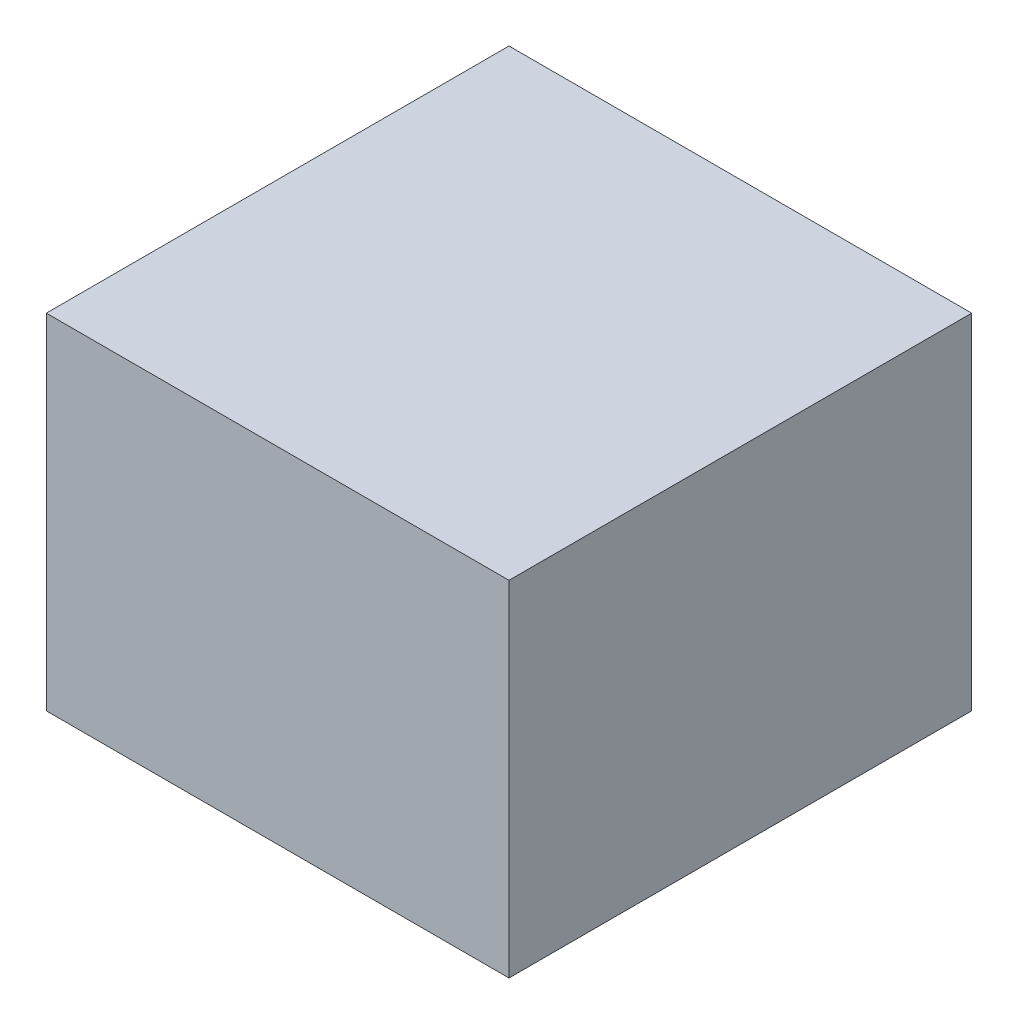
ISO-10303-21;
HEADER;
FILE_DESCRIPTION(('STEP AP214'),'2;1');
FILE_NAME('part.step','',(''),(''),'','','');
FILE_SCHEMA(('AUTOMOTIVE_DESIGN { 1 0 10303 214 1 1 1 1 }'));
ENDSEC;
DATA;
#1=APPLICATION_CONTEXT('core data for automotive mechanical design processes');
#2=APPLICATION_PROTOCOL_DEFINITION('international standard','automotive_design',2000,#1);
#3=PRODUCT_CONTEXT('',#1,'mechanical');
#4=PRODUCT('Part','Part','',(#3));
#5=PRODUCT_RELATED_PRODUCT_CATEGORY('part','',(#4));
#6=PRODUCT_DEFINITION_FORMATION('','',#4);
#7=PRODUCT_DEFINITION_CONTEXT('part definition',#1,'design');
#8=PRODUCT_DEFINITION('design','',#6,#7);
#9=PRODUCT_DEFINITION_SHAPE('','',#8);
#10=(LENGTH_UNIT() NAMED_UNIT(*) SI_UNIT(.MILLI.,.METRE.));
#11=(NAMED_UNIT(*) PLANE_ANGLE_UNIT() SI_UNIT($,.RADIAN.));
#12=(NAMED_UNIT(*) SI_UNIT($,.STERADIAN.) SOLID_ANGLE_UNIT());
#13=UNCERTAINTY_MEASURE_WITH_UNIT(LENGTH_MEASURE(1.E-05),#10,'distance_accuracy_value','');
#14=(GEOMETRIC_REPRESENTATION_CONTEXT(3) GLOBAL_UNCERTAINTY_ASSIGNED_CONTEXT((#13)) GLOBAL_UNIT_ASSIGNED_CONTEXT((#10,
#11,#12)) REPRESENTATION_CONTEXT('',''));
#15=CARTESIAN_POINT('',(0.,0.,0.));
#16=DIRECTION('',(0.,0.,1.));
#17=DIRECTION('',(1.,0.,0.));
#18=AXIS2_PLACEMENT_3D('',#15,#16,#17);
#19=CARTESIAN_POINT('',(0.,33.5,0.));
#20=DIRECTION('',(1.,0.,0.));
#21=DIRECTION('',(0.,0.,-1.));
#22=AXIS2_PLACEMENT_3D('',#19,#20,#21);
#23=PLANE('',#22);
#24=DIRECTION('',(0.,0.,1.));
#25=VECTOR('',#24,1.);
#26=CARTESIAN_POINT('',(0.,0.,0.));
#27=LINE('',#26,#25);
#28=CARTESIAN_POINT('',(0.,0.,-45.));
#29=VERTEX_POINT('',#28);
#30=CARTESIAN_POINT('',(0.,0.,0.));
#31=VERTEX_POINT('',#30);
#32=EDGE_CURVE('E113',#29,#31,#27,.T.);
#33=ORIENTED_EDGE('',*,*,#32,.T.);
#34=DIRECTION('',(0.,-1.,0.));
#35=VECTOR('',#34,1.);
#36=CARTESIAN_POINT('',(0.,33.5,0.));
#37=LINE('',#36,#35);
#38=CARTESIAN_POINT('',(0.,33.5,0.));
#39=VERTEX_POINT('',#38);
#40=EDGE_CURVE('E11',#39,#31,#37,.T.);
#41=ORIENTED_EDGE('',*,*,#40,.F.);
#42=DIRECTION('',(0.,0.,1.));
#43=VECTOR('',#42,1.);
#44=CARTESIAN_POINT('',(0.,33.5,0.));
#45=LINE('',#44,#43);
#46=CARTESIAN_POINT('',(0.,33.5,-45.));
#47=VERTEX_POINT('',#46);
#48=EDGE_CURVE('E97',#47,#39,#45,.T.);
#49=ORIENTED_EDGE('',*,*,#48,.F.);
#50=DIRECTION('',(0.,-1.,0.));
#51=VECTOR('',#50,1.);
#52=CARTESIAN_POINT('',(0.,33.5,-45.));
#53=LINE('',#52,#51);
#54=EDGE_CURVE('E109',#47,#29,#53,.T.);
#55=ORIENTED_EDGE('',*,*,#54,.T.);
#56=EDGE_LOOP('',(#33,#41,#49,#55));
#57=FACE_BOUND('',#56,.T.);
#58=ADVANCED_FACE('F45',(#57),#23,.F.);
#59=CARTESIAN_POINT('',(0.,33.5,0.));
#60=DIRECTION('',(0.,0.,-1.));
#61=DIRECTION('',(-1.,0.,0.));
#62=AXIS2_PLACEMENT_3D('',#59,#60,#61);
#63=PLANE('',#62);
#64=DIRECTION('',(1.,0.,0.));
#65=VECTOR('',#64,1.);
#66=CARTESIAN_POINT('',(0.,0.,0.));
#67=LINE('',#66,#65);
#68=CARTESIAN_POINT('',(45.,0.,0.));
#69=VERTEX_POINT('',#68);
#70=EDGE_CURVE('E102',#31,#69,#67,.T.);
#71=ORIENTED_EDGE('',*,*,#70,.T.);
#72=DIRECTION('',(0.,-1.,0.));
#73=VECTOR('',#72,1.);
#74=CARTESIAN_POINT('',(45.,33.5,0.));
#75=LINE('',#74,#73);
#76=CARTESIAN_POINT('',(45.,33.5,0.));
#77=VERTEX_POINT('',#76);
#78=EDGE_CURVE('E54',#77,#69,#75,.T.);
#79=ORIENTED_EDGE('',*,*,#78,.F.);
#80=DIRECTION('',(1.,0.,0.));
#81=VECTOR('',#80,1.);
#82=CARTESIAN_POINT('',(0.,33.5,0.));
#83=LINE('',#82,#81);
#84=EDGE_CURVE('E92',#39,#77,#83,.T.);
#85=ORIENTED_EDGE('',*,*,#84,.F.);
#86=ORIENTED_EDGE('',*,*,#40,.T.);
#87=EDGE_LOOP('',(#71,#79,#85,#86));
#88=FACE_BOUND('',#87,.T.);
#89=ADVANCED_FACE('F101',(#88),#63,.F.);
#90=CARTESIAN_POINT('',(45.,33.5,0.));
#91=DIRECTION('',(-1.,0.,0.));
#92=DIRECTION('',(0.,0.,1.));
#93=AXIS2_PLACEMENT_3D('',#90,#91,#92);
#94=PLANE('',#93);
#95=DIRECTION('',(0.,0.,-1.));
#96=VECTOR('',#95,1.);
#97=CARTESIAN_POINT('',(45.,0.,0.));
#98=LINE('',#97,#96);
#99=CARTESIAN_POINT('',(45.,0.,-45.));
#100=VERTEX_POINT('',#99);
#101=EDGE_CURVE('E79',#69,#100,#98,.T.);
#102=ORIENTED_EDGE('',*,*,#101,.T.);
#103=DIRECTION('',(0.,-1.,0.));
#104=VECTOR('',#103,1.);
#105=CARTESIAN_POINT('',(45.,33.5,-45.));
#106=LINE('',#105,#104);
#107=CARTESIAN_POINT('',(45.,33.5,-45.));
#108=VERTEX_POINT('',#107);
#109=EDGE_CURVE('E104',#108,#100,#106,.T.);
#110=ORIENTED_EDGE('',*,*,#109,.F.);
#111=DIRECTION('',(0.,0.,-1.));
#112=VECTOR('',#111,1.);
#113=CARTESIAN_POINT('',(45.,33.5,0.));
#114=LINE('',#113,#112);
#115=EDGE_CURVE('E95',#77,#108,#114,.T.);
#116=ORIENTED_EDGE('',*,*,#115,.F.);
#117=ORIENTED_EDGE('',*,*,#78,.T.);
#118=EDGE_LOOP('',(#102,#110,#116,#117));
#119=FACE_BOUND('',#118,.T.);
#120=ADVANCED_FACE('F105',(#119),#94,.F.);
#121=CARTESIAN_POINT('',(0.,33.5,-45.));
#122=DIRECTION('',(0.,0.,1.));
#123=DIRECTION('',(1.,0.,0.));
#124=AXIS2_PLACEMENT_3D('',#121,#122,#123);
#125=PLANE('',#124);
#126=DIRECTION('',(-1.,0.,0.));
#127=VECTOR('',#126,1.);
#128=CARTESIAN_POINT('',(0.,0.,-45.));
#129=LINE('',#128,#127);
#130=EDGE_CURVE('E85',#100,#29,#129,.T.);
#131=ORIENTED_EDGE('',*,*,#130,.T.);
#132=ORIENTED_EDGE('',*,*,#54,.F.);
#133=DIRECTION('',(-1.,0.,0.));
#134=VECTOR('',#133,1.);
#135=CARTESIAN_POINT('',(0.,33.5,-45.));
#136=LINE('',#135,#134);
#137=EDGE_CURVE('E62',#108,#47,#136,.T.);
#138=ORIENTED_EDGE('',*,*,#137,.F.);
#139=ORIENTED_EDGE('',*,*,#109,.T.);
#140=EDGE_LOOP('',(#131,#132,#138,#139));
#141=FACE_BOUND('',#140,.T.);
#142=ADVANCED_FACE('F126',(#141),#125,.F.);
#143=CARTESIAN_POINT('',(0.,33.5,0.));
#144=DIRECTION('',(0.,-1.,0.));
#145=DIRECTION('',(0.,0.,-1.));
#146=AXIS2_PLACEMENT_3D('',#143,#144,#145);
#147=PLANE('',#146);
#148=ORIENTED_EDGE('',*,*,#48,.T.);
#149=ORIENTED_EDGE('',*,*,#84,.T.);
#150=ORIENTED_EDGE('',*,*,#115,.T.);
#151=ORIENTED_EDGE('',*,*,#137,.T.);
#152=EDGE_LOOP('',(#148,#149,#150,#151));
#153=FACE_BOUND('',#152,.T.);
#154=ADVANCED_FACE('F93',(#153),#147,.F.);
#155=CARTESIAN_POINT('',(0.,0.,0.));
#156=DIRECTION('',(0.,-1.,0.));
#157=DIRECTION('',(0.,0.,-1.));
#158=AXIS2_PLACEMENT_3D('',#155,#156,#157);
#159=PLANE('',#158);
#160=ORIENTED_EDGE('',*,*,#32,.F.);
#161=ORIENTED_EDGE('',*,*,#130,.F.);
#162=ORIENTED_EDGE('',*,*,#101,.F.);
#163=ORIENTED_EDGE('',*,*,#70,.F.);
#164=EDGE_LOOP('',(#160,#161,#162,#163));
#165=FACE_BOUND('',#164,.T.);
#166=ADVANCED_FACE('F129',(#165),#159,.T.);
#167=CLOSED_SHELL('',(#58,#89,#120,#142,#154,#166));
#168=MANIFOLD_SOLID_BREP('B2',#167);
#169=ADVANCED_BREP_SHAPE_REPRESENTATION('',(#18,#168),#14);
#170=SHAPE_DEFINITION_REPRESENTATION(#9,#169);
ENDSEC;
END-ISO-10303-21;
